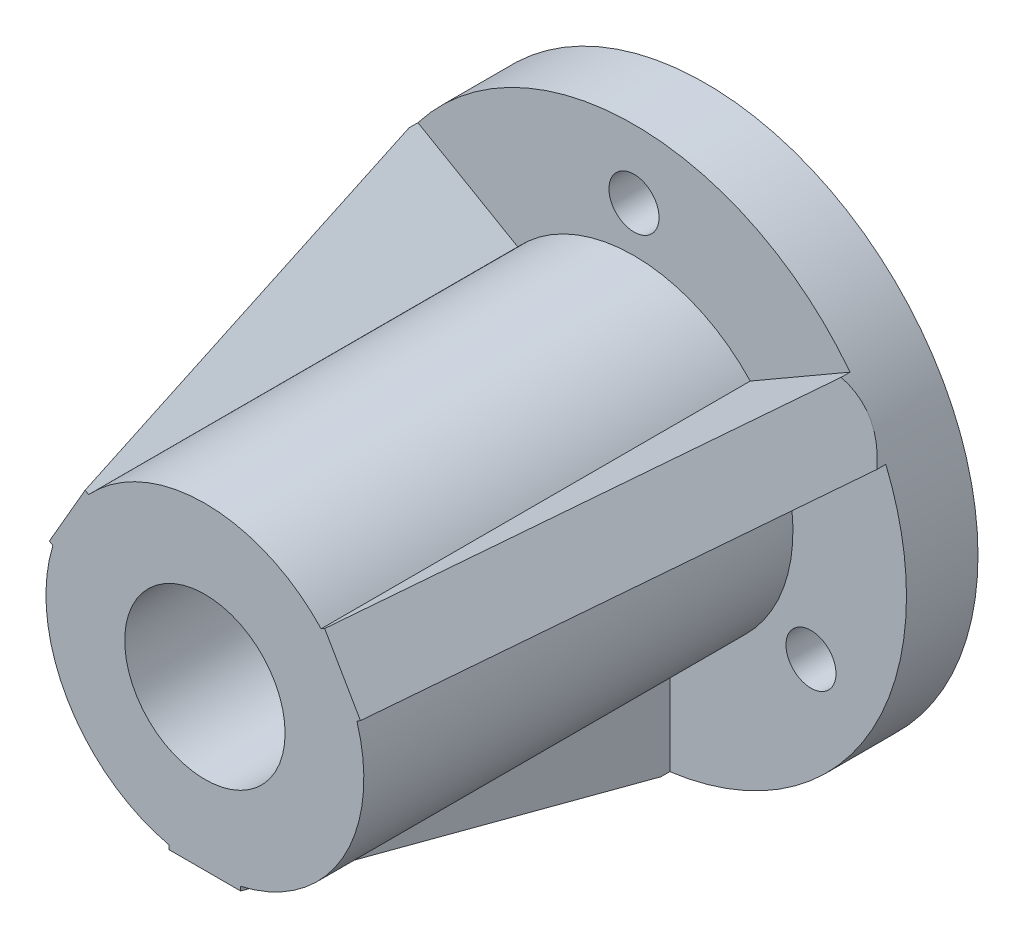
ISO-10303-21;
HEADER;
FILE_DESCRIPTION(('STEP AP214'),'2;1');
FILE_NAME('part.step','',(''),(''),'','','');
FILE_SCHEMA(('AUTOMOTIVE_DESIGN { 1 0 10303 214 1 1 1 1 }'));
ENDSEC;
DATA;
#1=APPLICATION_CONTEXT('core data for automotive mechanical design processes');
#2=APPLICATION_PROTOCOL_DEFINITION('international standard','automotive_design',2000,#1);
#3=PRODUCT_CONTEXT('',#1,'mechanical');
#4=PRODUCT('Part','Part','',(#3));
#5=PRODUCT_RELATED_PRODUCT_CATEGORY('part','',(#4));
#6=PRODUCT_DEFINITION_FORMATION('','',#4);
#7=PRODUCT_DEFINITION_CONTEXT('part definition',#1,'design');
#8=PRODUCT_DEFINITION('design','',#6,#7);
#9=PRODUCT_DEFINITION_SHAPE('','',#8);
#10=(LENGTH_UNIT() NAMED_UNIT(*) SI_UNIT(.MILLI.,.METRE.));
#11=(NAMED_UNIT(*) PLANE_ANGLE_UNIT() SI_UNIT($,.RADIAN.));
#12=(NAMED_UNIT(*) SI_UNIT($,.STERADIAN.) SOLID_ANGLE_UNIT());
#13=UNCERTAINTY_MEASURE_WITH_UNIT(LENGTH_MEASURE(1.E-05),#10,'distance_accuracy_value','');
#14=(GEOMETRIC_REPRESENTATION_CONTEXT(3) GLOBAL_UNCERTAINTY_ASSIGNED_CONTEXT((#13)) GLOBAL_UNIT_ASSIGNED_CONTEXT((#10,
#11,#12)) REPRESENTATION_CONTEXT('',''));
#15=CARTESIAN_POINT('',(0.,0.,0.));
#16=DIRECTION('',(0.,0.,1.));
#17=DIRECTION('',(1.,0.,0.));
#18=AXIS2_PLACEMENT_3D('',#15,#16,#17);
#19=CARTESIAN_POINT('',(-2.50000000000001,-13.3549510592189,18.2737010592189));
#20=DIRECTION('',(1.,0.,0.));
#21=DIRECTION('',(0.,0.,-1.));
#22=AXIS2_PLACEMENT_3D('',#19,#20,#21);
#23=PLANE('',#22);
#24=DIRECTION('',(0.,-0.255781843958849,-0.966734528348404));
#25=VECTOR('',#24,1.);
#26=CARTESIAN_POINT('',(-2.50000000000001,-11.1125,35.));
#27=LINE('',#26,#25);
#28=CARTESIAN_POINT('',(-2.50000000000001,-11.1125,35.));
#29=VERTEX_POINT('',#28);
#30=CARTESIAN_POINT('',(-2.50000000000001,-18.8852455636669,5.62269393259763));
#31=VERTEX_POINT('',#30);
#32=EDGE_CURVE('E146',#29,#31,#27,.T.);
#33=ORIENTED_EDGE('',*,*,#32,.F.);
#34=DIRECTION('',(0.,1.,0.));
#35=VECTOR('',#34,1.);
#36=CARTESIAN_POINT('',(-2.50000000000001,-13.3549510592189,35.));
#37=LINE('',#36,#35);
#38=CARTESIAN_POINT('',(-2.50000000000001,-10.8276339174355,35.));
#39=VERTEX_POINT('',#38);
#40=EDGE_CURVE('E142',#39,#29,#37,.F.);
#41=ORIENTED_EDGE('',*,*,#40,.F.);
#42=DIRECTION('',(0.,0.,1.));
#43=VECTOR('',#42,1.);
#44=CARTESIAN_POINT('',(-2.50000000000001,-10.8276339174355,4.99999999999999));
#45=LINE('',#44,#43);
#46=CARTESIAN_POINT('',(-2.50000000000001,-10.8276339174355,4.99999999999999));
#47=VERTEX_POINT('',#46);
#48=EDGE_CURVE('E139',#47,#39,#45,.T.);
#49=ORIENTED_EDGE('',*,*,#48,.F.);
#50=DIRECTION('',(0.,1.,0.));
#51=VECTOR('',#50,1.);
#52=CARTESIAN_POINT('',(-2.50000000000001,0.,4.99999999999999));
#53=LINE('',#52,#51);
#54=CARTESIAN_POINT('',(-2.50000000000001,-18.8852455636669,4.99999999999999));
#55=VERTEX_POINT('',#54);
#56=EDGE_CURVE('E127',#55,#47,#53,.T.);
#57=ORIENTED_EDGE('',*,*,#56,.F.);
#58=DIRECTION('',(0.,0.,-1.));
#59=VECTOR('',#58,1.);
#60=CARTESIAN_POINT('',(-2.50000000000001,-18.8852455636669,18.2737010592189));
#61=LINE('',#60,#59);
#62=EDGE_CURVE('E203',#31,#55,#61,.T.);
#63=ORIENTED_EDGE('',*,*,#62,.F.);
#64=EDGE_LOOP('',(#33,#41,#49,#57,#63));
#65=FACE_BOUND('',#64,.T.);
#66=ADVANCED_FACE('F16',(#65),#23,.F.);
#67=CARTESIAN_POINT('',(2.50000000000001,-13.3549510592189,18.2737010592189));
#68=DIRECTION('',(1.,0.,0.));
#69=DIRECTION('',(0.,0.,-1.));
#70=AXIS2_PLACEMENT_3D('',#67,#68,#69);
#71=PLANE('',#70);
#72=DIRECTION('',(0.,1.,0.));
#73=VECTOR('',#72,1.);
#74=CARTESIAN_POINT('',(2.50000000000001,-13.3549510592189,35.));
#75=LINE('',#74,#73);
#76=CARTESIAN_POINT('',(2.50000000000001,-10.8276339174355,35.));
#77=VERTEX_POINT('',#76);
#78=CARTESIAN_POINT('',(2.50000000000001,-11.1125,35.));
#79=VERTEX_POINT('',#78);
#80=EDGE_CURVE('E189',#77,#79,#75,.F.);
#81=ORIENTED_EDGE('',*,*,#80,.T.);
#82=DIRECTION('',(0.,-0.255781843958849,-0.966734528348404));
#83=VECTOR('',#82,1.);
#84=CARTESIAN_POINT('',(2.50000000000001,-11.1125,35.));
#85=LINE('',#84,#83);
#86=CARTESIAN_POINT('',(2.50000000000001,-18.8852455636669,5.62269393259763));
#87=VERTEX_POINT('',#86);
#88=EDGE_CURVE('E143',#87,#79,#85,.F.);
#89=ORIENTED_EDGE('',*,*,#88,.F.);
#90=DIRECTION('',(0.,0.,-1.));
#91=VECTOR('',#90,1.);
#92=CARTESIAN_POINT('',(2.50000000000001,-18.8852455636669,18.2737010592189));
#93=LINE('',#92,#91);
#94=CARTESIAN_POINT('',(2.50000000000001,-18.8852455636669,4.99999999999999));
#95=VERTEX_POINT('',#94);
#96=EDGE_CURVE('E200',#87,#95,#93,.T.);
#97=ORIENTED_EDGE('',*,*,#96,.T.);
#98=DIRECTION('',(0.,1.,0.));
#99=VECTOR('',#98,1.);
#100=CARTESIAN_POINT('',(2.50000000000001,0.,4.99999999999999));
#101=LINE('',#100,#99);
#102=CARTESIAN_POINT('',(2.50000000000001,-10.8276339174355,4.99999999999999));
#103=VERTEX_POINT('',#102);
#104=EDGE_CURVE('E157',#103,#95,#101,.F.);
#105=ORIENTED_EDGE('',*,*,#104,.F.);
#106=DIRECTION('',(0.,0.,1.));
#107=VECTOR('',#106,1.);
#108=CARTESIAN_POINT('',(2.50000000000001,-10.8276339174355,4.99999999999999));
#109=LINE('',#108,#107);
#110=EDGE_CURVE('E266',#77,#103,#109,.F.);
#111=ORIENTED_EDGE('',*,*,#110,.F.);
#112=EDGE_LOOP('',(#81,#89,#97,#105,#111));
#113=FACE_BOUND('',#112,.T.);
#114=ADVANCED_FACE('F294',(#113),#71,.T.);
#115=CARTESIAN_POINT('',(12.8157268835814,4.51241202014833,18.2737010592189));
#116=DIRECTION('',(-0.5,0.866025403784439,0.));
#117=DIRECTION('',(-0.866025403784439,-0.5,0.));
#118=AXIS2_PLACEMENT_3D('',#115,#116,#117);
#119=PLANE('',#118);
#120=DIRECTION('',(-0.22151357469519,-0.127890921979424,0.966734528348404));
#121=VECTOR('',#120,1.);
#122=CARTESIAN_POINT('',(10.8737072995546,3.3911864905389,35.));
#123=LINE('',#122,#121);
#124=CARTESIAN_POINT('',(10.8737072995546,3.3911864905389,35.));
#125=VERTEX_POINT('',#124);
#126=CARTESIAN_POINT('',(17.6051024148429,7.27755927237235,5.62269393259759));
#127=VERTEX_POINT('',#126);
#128=EDGE_CURVE('E272',#125,#127,#123,.F.);
#129=ORIENTED_EDGE('',*,*,#128,.F.);
#130=DIRECTION('',(-0.866025403784439,-0.5,0.));
#131=VECTOR('',#130,1.);
#132=CARTESIAN_POINT('',(12.8157268835814,4.51241202014833,35.));
#133=LINE('',#132,#131);
#134=CARTESIAN_POINT('',(10.6270060353772,3.24875344925666,35.));
#135=VERTEX_POINT('',#134);
#136=EDGE_CURVE('E187',#135,#125,#133,.F.);
#137=ORIENTED_EDGE('',*,*,#136,.F.);
#138=DIRECTION('',(0.,0.,1.));
#139=VECTOR('',#138,1.);
#140=CARTESIAN_POINT('',(10.6270060353772,3.24875344925666,4.99999999999999));
#141=LINE('',#140,#139);
#142=CARTESIAN_POINT('',(10.6270060353772,3.24875344925666,4.99999999999999));
#143=VERTEX_POINT('',#142);
#144=EDGE_CURVE('E274',#143,#135,#141,.T.);
#145=ORIENTED_EDGE('',*,*,#144,.F.);
#146=DIRECTION('',(-0.86602540378444,-0.499999999999998,0.));
#147=VECTOR('',#146,1.);
#148=CARTESIAN_POINT('',(17.6051024148429,7.27755927237234,4.99999999999999));
#149=LINE('',#148,#147);
#150=CARTESIAN_POINT('',(17.6051024148429,7.27755927237234,4.99999999999999));
#151=VERTEX_POINT('',#150);
#152=EDGE_CURVE('E160',#151,#143,#149,.T.);
#153=ORIENTED_EDGE('',*,*,#152,.F.);
#154=DIRECTION('',(0.,0.,1.));
#155=VECTOR('',#154,1.);
#156=CARTESIAN_POINT('',(17.6051024148429,7.27755927237235,18.2737010592189));
#157=LINE('',#156,#155);
#158=EDGE_CURVE('E185',#127,#151,#157,.F.);
#159=ORIENTED_EDGE('',*,*,#158,.F.);
#160=EDGE_LOOP('',(#129,#137,#145,#153,#159));
#161=FACE_BOUND('',#160,.T.);
#162=ADVANCED_FACE('F333',(#161),#119,.F.);
#163=CARTESIAN_POINT('',(10.3157268835814,8.84253903907052,18.2737010592189));
#164=DIRECTION('',(-0.5,0.866025403784439,0.));
#165=DIRECTION('',(-0.866025403784439,-0.5,0.));
#166=AXIS2_PLACEMENT_3D('',#163,#164,#165);
#167=PLANE('',#166);
#168=DIRECTION('',(-0.866025403784439,-0.5,0.));
#169=VECTOR('',#168,1.);
#170=CARTESIAN_POINT('',(10.3157268835814,8.84253903907052,35.));
#171=LINE('',#170,#169);
#172=CARTESIAN_POINT('',(8.12700603537719,7.57888046817885,35.));
#173=VERTEX_POINT('',#172);
#174=CARTESIAN_POINT('',(8.37370729955457,7.7213135094611,35.));
#175=VERTEX_POINT('',#174);
#176=EDGE_CURVE('E177',#173,#175,#171,.F.);
#177=ORIENTED_EDGE('',*,*,#176,.T.);
#178=DIRECTION('',(-0.22151357469519,-0.127890921979424,0.966734528348404));
#179=VECTOR('',#178,1.);
#180=CARTESIAN_POINT('',(8.37370729955457,7.7213135094611,35.));
#181=LINE('',#180,#179);
#182=CARTESIAN_POINT('',(15.1051024148429,11.6076862912945,5.62269393259759));
#183=VERTEX_POINT('',#182);
#184=EDGE_CURVE('E265',#183,#175,#181,.T.);
#185=ORIENTED_EDGE('',*,*,#184,.F.);
#186=DIRECTION('',(0.,0.,1.));
#187=VECTOR('',#186,1.);
#188=CARTESIAN_POINT('',(15.1051024148429,11.6076862912945,18.2737010592189));
#189=LINE('',#188,#187);
#190=CARTESIAN_POINT('',(15.1051024148429,11.6076862912945,4.99999999999999));
#191=VERTEX_POINT('',#190);
#192=EDGE_CURVE('E182',#183,#191,#189,.F.);
#193=ORIENTED_EDGE('',*,*,#192,.T.);
#194=DIRECTION('',(0.866025403784438,0.500000000000001,0.));
#195=VECTOR('',#194,1.);
#196=CARTESIAN_POINT('',(8.12700603537719,7.57888046817885,4.99999999999999));
#197=LINE('',#196,#195);
#198=CARTESIAN_POINT('',(8.12700603537718,7.57888046817885,4.99999999999999));
#199=VERTEX_POINT('',#198);
#200=EDGE_CURVE('E152',#199,#191,#197,.T.);
#201=ORIENTED_EDGE('',*,*,#200,.F.);
#202=DIRECTION('',(0.,0.,1.));
#203=VECTOR('',#202,1.);
#204=CARTESIAN_POINT('',(8.12700603537719,7.57888046817885,4.99999999999999));
#205=LINE('',#204,#203);
#206=EDGE_CURVE('E262',#173,#199,#205,.F.);
#207=ORIENTED_EDGE('',*,*,#206,.F.);
#208=EDGE_LOOP('',(#177,#185,#193,#201,#207));
#209=FACE_BOUND('',#208,.T.);
#210=ADVANCED_FACE('F331',(#209),#167,.T.);
#211=CARTESIAN_POINT('',(-12.8157268835814,4.51241202014833,18.2737010592189));
#212=DIRECTION('',(-0.500000000000001,-0.866025403784438,0.));
#213=DIRECTION('',(0.866025403784438,-0.500000000000001,0.));
#214=AXIS2_PLACEMENT_3D('',#211,#212,#213);
#215=PLANE('',#214);
#216=DIRECTION('',(0.866025403784438,-0.500000000000001,0.));
#217=VECTOR('',#216,1.);
#218=CARTESIAN_POINT('',(-12.8157268835814,4.51241202014833,35.));
#219=LINE('',#218,#217);
#220=CARTESIAN_POINT('',(-10.6270060353772,3.24875344925666,35.));
#221=VERTEX_POINT('',#220);
#222=CARTESIAN_POINT('',(-10.8737072995546,3.39118649053891,35.));
#223=VERTEX_POINT('',#222);
#224=EDGE_CURVE('E34',#221,#223,#219,.F.);
#225=ORIENTED_EDGE('',*,*,#224,.T.);
#226=DIRECTION('',(0.22151357469519,-0.127890921979425,0.966734528348404));
#227=VECTOR('',#226,1.);
#228=CARTESIAN_POINT('',(-10.8737072995546,3.39118649053891,35.));
#229=LINE('',#228,#227);
#230=CARTESIAN_POINT('',(-17.6051024148429,7.27755927237236,5.62269393259765));
#231=VERTEX_POINT('',#230);
#232=EDGE_CURVE('E261',#231,#223,#229,.T.);
#233=ORIENTED_EDGE('',*,*,#232,.F.);
#234=DIRECTION('',(0.,0.,1.));
#235=VECTOR('',#234,1.);
#236=CARTESIAN_POINT('',(-17.6051024148429,7.27755927237235,18.2737010592189));
#237=LINE('',#236,#235);
#238=CARTESIAN_POINT('',(-17.6051024148429,7.27755927237236,4.99999999999999));
#239=VERTEX_POINT('',#238);
#240=EDGE_CURVE('E175',#231,#239,#237,.F.);
#241=ORIENTED_EDGE('',*,*,#240,.T.);
#242=DIRECTION('',(-0.866025403784438,0.500000000000001,0.));
#243=VECTOR('',#242,1.);
#244=CARTESIAN_POINT('',(-10.6270060353772,3.24875344925666,4.99999999999999));
#245=LINE('',#244,#243);
#246=CARTESIAN_POINT('',(-10.6270060353772,3.24875344925666,4.99999999999999));
#247=VERTEX_POINT('',#246);
#248=EDGE_CURVE('E135',#247,#239,#245,.T.);
#249=ORIENTED_EDGE('',*,*,#248,.F.);
#250=DIRECTION('',(0.,0.,1.));
#251=VECTOR('',#250,1.);
#252=CARTESIAN_POINT('',(-10.6270060353772,3.24875344925666,4.99999999999999));
#253=LINE('',#252,#251);
#254=EDGE_CURVE('E120',#221,#247,#253,.F.);
#255=ORIENTED_EDGE('',*,*,#254,.F.);
#256=EDGE_LOOP('',(#225,#233,#241,#249,#255));
#257=FACE_BOUND('',#256,.T.);
#258=ADVANCED_FACE('F298',(#257),#215,.T.);
#259=CARTESIAN_POINT('',(-10.3157268835814,8.84253903907055,18.2737010592189));
#260=DIRECTION('',(-0.500000000000001,-0.866025403784438,0.));
#261=DIRECTION('',(0.866025403784438,-0.500000000000001,0.));
#262=AXIS2_PLACEMENT_3D('',#259,#260,#261);
#263=PLANE('',#262);
#264=DIRECTION('',(0.22151357469519,-0.127890921979425,0.966734528348404));
#265=VECTOR('',#264,1.);
#266=CARTESIAN_POINT('',(-8.37370729955457,7.72131350946109,35.));
#267=LINE('',#266,#265);
#268=CARTESIAN_POINT('',(-8.37370729955457,7.7213135094611,35.));
#269=VERTEX_POINT('',#268);
#270=CARTESIAN_POINT('',(-15.1051024148429,11.6076862912946,5.62269393259761));
#271=VERTEX_POINT('',#270);
#272=EDGE_CURVE('E258',#269,#271,#267,.F.);
#273=ORIENTED_EDGE('',*,*,#272,.F.);
#274=DIRECTION('',(0.866025403784438,-0.500000000000001,0.));
#275=VECTOR('',#274,1.);
#276=CARTESIAN_POINT('',(-10.3157268835814,8.84253903907055,35.));
#277=LINE('',#276,#275);
#278=CARTESIAN_POINT('',(-8.12700603537717,7.57888046817887,35.));
#279=VERTEX_POINT('',#278);
#280=EDGE_CURVE('E164',#279,#269,#277,.F.);
#281=ORIENTED_EDGE('',*,*,#280,.F.);
#282=DIRECTION('',(0.,0.,1.));
#283=VECTOR('',#282,1.);
#284=CARTESIAN_POINT('',(-8.12700603537717,7.57888046817886,4.99999999999999));
#285=LINE('',#284,#283);
#286=CARTESIAN_POINT('',(-8.12700603537717,7.57888046817886,4.99999999999999));
#287=VERTEX_POINT('',#286);
#288=EDGE_CURVE('E312',#287,#279,#285,.T.);
#289=ORIENTED_EDGE('',*,*,#288,.F.);
#290=DIRECTION('',(0.866025403784439,-0.5,0.));
#291=VECTOR('',#290,1.);
#292=CARTESIAN_POINT('',(-15.1051024148429,11.6076862912946,4.99999999999999));
#293=LINE('',#292,#291);
#294=CARTESIAN_POINT('',(-15.1051024148429,11.6076862912946,4.99999999999999));
#295=VERTEX_POINT('',#294);
#296=EDGE_CURVE('E134',#295,#287,#293,.T.);
#297=ORIENTED_EDGE('',*,*,#296,.F.);
#298=DIRECTION('',(0.,0.,1.));
#299=VECTOR('',#298,1.);
#300=CARTESIAN_POINT('',(-15.1051024148429,11.6076862912946,18.2737010592189));
#301=LINE('',#300,#299);
#302=EDGE_CURVE('E162',#271,#295,#301,.F.);
#303=ORIENTED_EDGE('',*,*,#302,.F.);
#304=EDGE_LOOP('',(#273,#281,#289,#297,#303));
#305=FACE_BOUND('',#304,.T.);
#306=ADVANCED_FACE('F388',(#305),#263,.F.);
#307=CARTESIAN_POINT('',(0.,0.,4.99999999999999));
#308=DIRECTION('',(0.,0.,1.));
#309=DIRECTION('',(1.,0.,0.));
#310=AXIS2_PLACEMENT_3D('',#307,#308,#309);
#311=PLANE('',#310);
#312=CARTESIAN_POINT('',(12.3733379565702,-7.14375,4.99999999999999));
#313=DIRECTION('',(0.,0.,-1.));
#314=DIRECTION('',(-1.,0.,0.));
#315=AXIS2_PLACEMENT_3D('',#312,#313,#314);
#316=CIRCLE('',#315,1.75000000000001);
#317=CARTESIAN_POINT('',(10.6233379565702,-7.14375,4.99999999999999));
#318=VERTEX_POINT('',#317);
#319=EDGE_CURVE('E239',#318,#318,#316,.T.);
#320=ORIENTED_EDGE('',*,*,#319,.T.);
#321=EDGE_LOOP('',(#320));
#322=FACE_BOUND('',#321,.T.);
#323=ORIENTED_EDGE('',*,*,#104,.T.);
#324=CARTESIAN_POINT('',(0.,0.,4.99999999999999));
#325=DIRECTION('',(0.,0.,1.));
#326=DIRECTION('',(1.,0.,0.));
#327=AXIS2_PLACEMENT_3D('',#324,#325,#326);
#328=CIRCLE('',#327,19.05);
#329=EDGE_CURVE('E255',#151,#95,#328,.F.);
#330=ORIENTED_EDGE('',*,*,#329,.F.);
#331=ORIENTED_EDGE('',*,*,#152,.T.);
#332=CARTESIAN_POINT('',(0.,0.,4.99999999999999));
#333=DIRECTION('',(0.,0.,1.));
#334=DIRECTION('',(1.,0.,0.));
#335=AXIS2_PLACEMENT_3D('',#332,#333,#334);
#336=CIRCLE('',#335,11.1125);
#337=EDGE_CURVE('E263',#103,#143,#336,.T.);
#338=ORIENTED_EDGE('',*,*,#337,.F.);
#339=EDGE_LOOP('',(#323,#330,#331,#338));
#340=FACE_BOUND('',#339,.T.);
#341=ADVANCED_FACE('F390',(#322,#340),#311,.T.);
#342=CARTESIAN_POINT('',(0.,0.,4.99999999999999));
#343=DIRECTION('',(0.,0.,1.));
#344=DIRECTION('',(1.,0.,0.));
#345=AXIS2_PLACEMENT_3D('',#342,#343,#344);
#346=PLANE('',#345);
#347=CARTESIAN_POINT('',(-12.3733379565702,-7.14375,4.99999999999999));
#348=DIRECTION('',(0.,0.,-1.));
#349=DIRECTION('',(-1.,0.,0.));
#350=AXIS2_PLACEMENT_3D('',#347,#348,#349);
#351=CIRCLE('',#350,1.75000000000001);
#352=CARTESIAN_POINT('',(-14.1233379565702,-7.14375,4.99999999999999));
#353=VERTEX_POINT('',#352);
#354=EDGE_CURVE('E236',#353,#353,#351,.T.);
#355=ORIENTED_EDGE('',*,*,#354,.T.);
#356=EDGE_LOOP('',(#355));
#357=FACE_BOUND('',#356,.T.);
#358=ORIENTED_EDGE('',*,*,#56,.T.);
#359=CARTESIAN_POINT('',(0.,0.,4.99999999999999));
#360=DIRECTION('',(0.,0.,1.));
#361=DIRECTION('',(1.,0.,0.));
#362=AXIS2_PLACEMENT_3D('',#359,#360,#361);
#363=CIRCLE('',#362,11.1125);
#364=EDGE_CURVE('E19',#247,#47,#363,.T.);
#365=ORIENTED_EDGE('',*,*,#364,.F.);
#366=ORIENTED_EDGE('',*,*,#248,.T.);
#367=CARTESIAN_POINT('',(0.,0.,4.99999999999999));
#368=DIRECTION('',(0.,0.,1.));
#369=DIRECTION('',(1.,0.,0.));
#370=AXIS2_PLACEMENT_3D('',#367,#368,#369);
#371=CIRCLE('',#370,19.05);
#372=EDGE_CURVE('E131',#55,#239,#371,.F.);
#373=ORIENTED_EDGE('',*,*,#372,.F.);
#374=EDGE_LOOP('',(#358,#365,#366,#373));
#375=FACE_BOUND('',#374,.T.);
#376=ADVANCED_FACE('F128',(#357,#375),#346,.T.);
#377=CARTESIAN_POINT('',(0.,0.,4.99999999999999));
#378=DIRECTION('',(0.,0.,1.));
#379=DIRECTION('',(1.,0.,0.));
#380=AXIS2_PLACEMENT_3D('',#377,#378,#379);
#381=PLANE('',#380);
#382=CARTESIAN_POINT('',(0.,14.2875,4.99999999999999));
#383=DIRECTION('',(0.,0.,-1.));
#384=DIRECTION('',(-1.,0.,0.));
#385=AXIS2_PLACEMENT_3D('',#382,#383,#384);
#386=CIRCLE('',#385,1.75000000000001);
#387=CARTESIAN_POINT('',(-1.75000000000001,14.2875,4.99999999999999));
#388=VERTEX_POINT('',#387);
#389=EDGE_CURVE('E233',#388,#388,#386,.T.);
#390=ORIENTED_EDGE('',*,*,#389,.T.);
#391=EDGE_LOOP('',(#390));
#392=FACE_BOUND('',#391,.T.);
#393=ORIENTED_EDGE('',*,*,#200,.T.);
#394=CARTESIAN_POINT('',(0.,0.,4.99999999999999));
#395=DIRECTION('',(0.,0.,1.));
#396=DIRECTION('',(1.,0.,0.));
#397=AXIS2_PLACEMENT_3D('',#394,#395,#396);
#398=CIRCLE('',#397,19.05);
#399=EDGE_CURVE('E245',#295,#191,#398,.F.);
#400=ORIENTED_EDGE('',*,*,#399,.F.);
#401=ORIENTED_EDGE('',*,*,#296,.T.);
#402=CARTESIAN_POINT('',(0.,0.,4.99999999999999));
#403=DIRECTION('',(0.,0.,1.));
#404=DIRECTION('',(1.,0.,0.));
#405=AXIS2_PLACEMENT_3D('',#402,#403,#404);
#406=CIRCLE('',#405,11.1125);
#407=EDGE_CURVE('E259',#199,#287,#406,.T.);
#408=ORIENTED_EDGE('',*,*,#407,.F.);
#409=EDGE_LOOP('',(#393,#400,#401,#408));
#410=FACE_BOUND('',#409,.T.);
#411=ADVANCED_FACE('F386',(#392,#410),#381,.T.);
#412=CARTESIAN_POINT('',(0.,0.,4.99999999999999));
#413=DIRECTION('',(0.,0.,1.));
#414=DIRECTION('',(1.,0.,0.));
#415=AXIS2_PLACEMENT_3D('',#412,#413,#414);
#416=CYLINDRICAL_SURFACE('',#415,11.1125);
#417=ORIENTED_EDGE('',*,*,#48,.T.);
#418=CARTESIAN_POINT('',(0.,0.,35.));
#419=DIRECTION('',(0.,0.,1.));
#420=DIRECTION('',(1.,0.,0.));
#421=AXIS2_PLACEMENT_3D('',#418,#419,#420);
#422=CIRCLE('',#421,11.1125);
#423=EDGE_CURVE('E211',#221,#39,#422,.T.);
#424=ORIENTED_EDGE('',*,*,#423,.F.);
#425=ORIENTED_EDGE('',*,*,#254,.T.);
#426=ORIENTED_EDGE('',*,*,#364,.T.);
#427=EDGE_LOOP('',(#417,#424,#425,#426));
#428=FACE_BOUND('',#427,.T.);
#429=ADVANCED_FACE('F138',(#428),#416,.T.);
#430=CARTESIAN_POINT('',(0.,-11.1125,35.));
#431=DIRECTION('',(0.,-0.966734528348404,0.255781843958849));
#432=DIRECTION('',(0.,-0.255781843958849,-0.966734528348404));
#433=AXIS2_PLACEMENT_3D('',#430,#431,#432);
#434=PLANE('',#433);
#435=DIRECTION('',(1.,0.,0.));
#436=VECTOR('',#435,1.);
#437=CARTESIAN_POINT('',(0.,-11.1125,35.));
#438=LINE('',#437,#436);
#439=EDGE_CURVE('E208',#29,#79,#438,.T.);
#440=ORIENTED_EDGE('',*,*,#439,.F.);
#441=ORIENTED_EDGE('',*,*,#32,.T.);
#442=CARTESIAN_POINT('',(0.,0.,76.9999999999999));
#443=DIRECTION('',(0.,-0.966734528348404,0.255781843958849));
#444=DIRECTION('',(0.,0.255781843958849,0.966734528348404));
#445=AXIS2_PLACEMENT_3D('',#442,#443,#444);
#446=ELLIPSE('',#445,74.477530168501,19.05);
#447=EDGE_CURVE('E252',#87,#31,#446,.F.);
#448=ORIENTED_EDGE('',*,*,#447,.F.);
#449=ORIENTED_EDGE('',*,*,#88,.T.);
#450=EDGE_LOOP('',(#440,#441,#448,#449));
#451=FACE_BOUND('',#450,.T.);
#452=ADVANCED_FACE('F288',(#451),#434,.T.);
#453=CARTESIAN_POINT('',(0.,0.,4.99999999999999));
#454=DIRECTION('',(0.,0.,1.));
#455=DIRECTION('',(1.,0.,0.));
#456=AXIS2_PLACEMENT_3D('',#453,#454,#455);
#457=CYLINDRICAL_SURFACE('',#456,11.1125);
#458=ORIENTED_EDGE('',*,*,#110,.T.);
#459=ORIENTED_EDGE('',*,*,#337,.T.);
#460=ORIENTED_EDGE('',*,*,#144,.T.);
#461=CARTESIAN_POINT('',(0.,0.,35.));
#462=DIRECTION('',(0.,0.,1.));
#463=DIRECTION('',(1.,0.,0.));
#464=AXIS2_PLACEMENT_3D('',#461,#462,#463);
#465=CIRCLE('',#464,11.1125);
#466=EDGE_CURVE('E195',#77,#135,#465,.T.);
#467=ORIENTED_EDGE('',*,*,#466,.F.);
#468=EDGE_LOOP('',(#458,#459,#460,#467));
#469=FACE_BOUND('',#468,.T.);
#470=ADVANCED_FACE('F334',(#469),#457,.T.);
#471=CARTESIAN_POINT('',(9.62370729955458,5.55625,35.));
#472=DIRECTION('',(0.837216660265286,0.483367264174202,0.255781843958849));
#473=DIRECTION('',(-0.5,0.866025403784439,0.));
#474=AXIS2_PLACEMENT_3D('',#471,#472,#473);
#475=PLANE('',#474);
#476=DIRECTION('',(-0.500000000000001,0.866025403784438,0.));
#477=VECTOR('',#476,1.);
#478=CARTESIAN_POINT('',(10.8737072995546,3.39118649053891,35.));
#479=LINE('',#478,#477);
#480=EDGE_CURVE('E192',#125,#175,#479,.T.);
#481=ORIENTED_EDGE('',*,*,#480,.F.);
#482=ORIENTED_EDGE('',*,*,#128,.T.);
#483=CARTESIAN_POINT('',(0.,0.,77.));
#484=DIRECTION('',(0.837216660265286,0.483367264174202,0.255781843958849));
#485=DIRECTION('',(-0.22151357469519,-0.127890921979424,0.966734528348404));
#486=AXIS2_PLACEMENT_3D('',#483,#484,#485);
#487=ELLIPSE('',#486,74.4775301685011,19.05);
#488=EDGE_CURVE('E242',#183,#127,#487,.F.);
#489=ORIENTED_EDGE('',*,*,#488,.F.);
#490=ORIENTED_EDGE('',*,*,#184,.T.);
#491=EDGE_LOOP('',(#481,#482,#489,#490));
#492=FACE_BOUND('',#491,.T.);
#493=ADVANCED_FACE('F324',(#492),#475,.T.);
#494=CARTESIAN_POINT('',(0.,0.,4.99999999999999));
#495=DIRECTION('',(0.,0.,1.));
#496=DIRECTION('',(1.,0.,0.));
#497=AXIS2_PLACEMENT_3D('',#494,#495,#496);
#498=CYLINDRICAL_SURFACE('',#497,11.1125);
#499=ORIENTED_EDGE('',*,*,#206,.T.);
#500=ORIENTED_EDGE('',*,*,#407,.T.);
#501=ORIENTED_EDGE('',*,*,#288,.T.);
#502=CARTESIAN_POINT('',(0.,0.,35.));
#503=DIRECTION('',(0.,0.,1.));
#504=DIRECTION('',(1.,0.,0.));
#505=AXIS2_PLACEMENT_3D('',#502,#503,#504);
#506=CIRCLE('',#505,11.1125);
#507=EDGE_CURVE('E172',#173,#279,#506,.T.);
#508=ORIENTED_EDGE('',*,*,#507,.F.);
#509=EDGE_LOOP('',(#499,#500,#501,#508));
#510=FACE_BOUND('',#509,.T.);
#511=ADVANCED_FACE('F342',(#510),#498,.T.);
#512=CARTESIAN_POINT('',(-9.62370729955458,5.55625,35.));
#513=DIRECTION('',(-0.837216660265285,0.483367264174203,0.255781843958849));
#514=DIRECTION('',(-0.500000000000001,-0.866025403784438,0.));
#515=AXIS2_PLACEMENT_3D('',#512,#513,#514);
#516=PLANE('',#515);
#517=DIRECTION('',(-0.500000000000001,-0.866025403784438,0.));
#518=VECTOR('',#517,1.);
#519=CARTESIAN_POINT('',(-8.37370729955457,7.7213135094611,35.));
#520=LINE('',#519,#518);
#521=EDGE_CURVE('E168',#269,#223,#520,.T.);
#522=ORIENTED_EDGE('',*,*,#521,.F.);
#523=ORIENTED_EDGE('',*,*,#272,.T.);
#524=CARTESIAN_POINT('',(0.,0.,77.));
#525=DIRECTION('',(-0.837216660265285,0.483367264174203,0.255781843958849));
#526=DIRECTION('',(0.22151357469519,-0.127890921979425,0.966734528348404));
#527=AXIS2_PLACEMENT_3D('',#524,#525,#526);
#528=ELLIPSE('',#527,74.477530168501,19.05);
#529=EDGE_CURVE('E248',#231,#271,#528,.F.);
#530=ORIENTED_EDGE('',*,*,#529,.F.);
#531=ORIENTED_EDGE('',*,*,#232,.T.);
#532=EDGE_LOOP('',(#522,#523,#530,#531));
#533=FACE_BOUND('',#532,.T.);
#534=ADVANCED_FACE('F303',(#533),#516,.T.);
#535=CARTESIAN_POINT('',(0.,0.,0.));
#536=DIRECTION('',(0.,0.,1.));
#537=DIRECTION('',(1.,0.,0.));
#538=AXIS2_PLACEMENT_3D('',#535,#536,#537);
#539=CYLINDRICAL_SURFACE('',#538,19.05);
#540=CARTESIAN_POINT('',(0.,0.,0.));
#541=DIRECTION('',(0.,0.,1.));
#542=DIRECTION('',(1.,0.,0.));
#543=AXIS2_PLACEMENT_3D('',#540,#541,#542);
#544=CIRCLE('',#543,19.05);
#545=CARTESIAN_POINT('',(19.05,0.,0.));
#546=VERTEX_POINT('',#545);
#547=EDGE_CURVE('E171',#546,#546,#544,.T.);
#548=ORIENTED_EDGE('',*,*,#547,.T.);
#549=EDGE_LOOP('',(#548));
#550=FACE_BOUND('',#549,.T.);
#551=ORIENTED_EDGE('',*,*,#488,.T.);
#552=ORIENTED_EDGE('',*,*,#158,.T.);
#553=ORIENTED_EDGE('',*,*,#329,.T.);
#554=ORIENTED_EDGE('',*,*,#96,.F.);
#555=ORIENTED_EDGE('',*,*,#447,.T.);
#556=ORIENTED_EDGE('',*,*,#62,.T.);
#557=ORIENTED_EDGE('',*,*,#372,.T.);
#558=ORIENTED_EDGE('',*,*,#240,.F.);
#559=ORIENTED_EDGE('',*,*,#529,.T.);
#560=ORIENTED_EDGE('',*,*,#302,.T.);
#561=ORIENTED_EDGE('',*,*,#399,.T.);
#562=ORIENTED_EDGE('',*,*,#192,.F.);
#563=EDGE_LOOP('',(#551,#552,#553,#554,#555,#556,#557,#558,#559,#560,#561,#562));
#564=FACE_BOUND('',#563,.T.);
#565=ADVANCED_FACE('F290',(#550,#564),#539,.T.);
#566=CARTESIAN_POINT('',(12.3733379565702,-7.14375,4.99999999999999));
#567=DIRECTION('',(0.,0.,-1.));
#568=DIRECTION('',(-1.,0.,0.));
#569=AXIS2_PLACEMENT_3D('',#566,#567,#568);
#570=CYLINDRICAL_SURFACE('',#569,1.75000000000001);
#571=ORIENTED_EDGE('',*,*,#319,.F.);
#572=EDGE_LOOP('',(#571));
#573=FACE_BOUND('',#572,.T.);
#574=CARTESIAN_POINT('',(12.3733379565702,-7.14375,0.));
#575=DIRECTION('',(0.,0.,-1.));
#576=DIRECTION('',(-1.,0.,0.));
#577=AXIS2_PLACEMENT_3D('',#574,#575,#576);
#578=CIRCLE('',#577,1.75000000000001);
#579=CARTESIAN_POINT('',(10.6233379565702,-7.14375,0.));
#580=VERTEX_POINT('',#579);
#581=EDGE_CURVE('E223',#580,#580,#578,.T.);
#582=ORIENTED_EDGE('',*,*,#581,.T.);
#583=EDGE_LOOP('',(#582));
#584=FACE_BOUND('',#583,.T.);
#585=ADVANCED_FACE('F368',(#573,#584),#570,.F.);
#586=CARTESIAN_POINT('',(-12.3733379565702,-7.14375,4.99999999999999));
#587=DIRECTION('',(0.,0.,-1.));
#588=DIRECTION('',(-1.,0.,0.));
#589=AXIS2_PLACEMENT_3D('',#586,#587,#588);
#590=CYLINDRICAL_SURFACE('',#589,1.75000000000001);
#591=ORIENTED_EDGE('',*,*,#354,.F.);
#592=EDGE_LOOP('',(#591));
#593=FACE_BOUND('',#592,.T.);
#594=CARTESIAN_POINT('',(-12.3733379565702,-7.14375,0.));
#595=DIRECTION('',(0.,0.,-1.));
#596=DIRECTION('',(-1.,0.,0.));
#597=AXIS2_PLACEMENT_3D('',#594,#595,#596);
#598=CIRCLE('',#597,1.75000000000001);
#599=CARTESIAN_POINT('',(-14.1233379565702,-7.14375,0.));
#600=VERTEX_POINT('',#599);
#601=EDGE_CURVE('E220',#600,#600,#598,.T.);
#602=ORIENTED_EDGE('',*,*,#601,.T.);
#603=EDGE_LOOP('',(#602));
#604=FACE_BOUND('',#603,.T.);
#605=ADVANCED_FACE('F364',(#593,#604),#590,.F.);
#606=CARTESIAN_POINT('',(0.,14.2875,4.99999999999999));
#607=DIRECTION('',(0.,0.,-1.));
#608=DIRECTION('',(-1.,0.,0.));
#609=AXIS2_PLACEMENT_3D('',#606,#607,#608);
#610=CYLINDRICAL_SURFACE('',#609,1.75000000000001);
#611=ORIENTED_EDGE('',*,*,#389,.F.);
#612=EDGE_LOOP('',(#611));
#613=FACE_BOUND('',#612,.T.);
#614=CARTESIAN_POINT('',(0.,14.2875,0.));
#615=DIRECTION('',(0.,0.,-1.));
#616=DIRECTION('',(-1.,0.,0.));
#617=AXIS2_PLACEMENT_3D('',#614,#615,#616);
#618=CIRCLE('',#617,1.75000000000001);
#619=CARTESIAN_POINT('',(-1.75000000000001,14.2875,0.));
#620=VERTEX_POINT('',#619);
#621=EDGE_CURVE('E217',#620,#620,#618,.T.);
#622=ORIENTED_EDGE('',*,*,#621,.T.);
#623=EDGE_LOOP('',(#622));
#624=FACE_BOUND('',#623,.T.);
#625=ADVANCED_FACE('F360',(#613,#624),#610,.F.);
#626=CARTESIAN_POINT('',(0.,0.,35.));
#627=DIRECTION('',(0.,0.,1.));
#628=DIRECTION('',(1.,0.,0.));
#629=AXIS2_PLACEMENT_3D('',#626,#627,#628);
#630=PLANE('',#629);
#631=CARTESIAN_POINT('',(0.,0.,35.));
#632=DIRECTION('',(0.,0.,1.));
#633=DIRECTION('',(1.,0.,0.));
#634=AXIS2_PLACEMENT_3D('',#631,#632,#633);
#635=CIRCLE('',#634,5.60625);
#636=CARTESIAN_POINT('',(5.60625,0.,35.));
#637=VERTEX_POINT('',#636);
#638=EDGE_CURVE('E25',#637,#637,#635,.F.);
#639=ORIENTED_EDGE('',*,*,#638,.T.);
#640=EDGE_LOOP('',(#639));
#641=FACE_BOUND('',#640,.T.);
#642=ORIENTED_EDGE('',*,*,#521,.T.);
#643=ORIENTED_EDGE('',*,*,#224,.F.);
#644=ORIENTED_EDGE('',*,*,#423,.T.);
#645=ORIENTED_EDGE('',*,*,#40,.T.);
#646=ORIENTED_EDGE('',*,*,#439,.T.);
#647=ORIENTED_EDGE('',*,*,#80,.F.);
#648=ORIENTED_EDGE('',*,*,#466,.T.);
#649=ORIENTED_EDGE('',*,*,#136,.T.);
#650=ORIENTED_EDGE('',*,*,#480,.T.);
#651=ORIENTED_EDGE('',*,*,#176,.F.);
#652=ORIENTED_EDGE('',*,*,#507,.T.);
#653=ORIENTED_EDGE('',*,*,#280,.T.);
#654=EDGE_LOOP('',(#642,#643,#644,#645,#646,#647,#648,#649,#650,#651,#652,#653));
#655=FACE_BOUND('',#654,.T.);
#656=ADVANCED_FACE('F296',(#641,#655),#630,.T.);
#657=CARTESIAN_POINT('',(0.,0.,0.));
#658=DIRECTION('',(0.,0.,1.));
#659=DIRECTION('',(1.,0.,0.));
#660=AXIS2_PLACEMENT_3D('',#657,#658,#659);
#661=PLANE('',#660);
#662=CARTESIAN_POINT('',(0.,0.,0.));
#663=DIRECTION('',(0.,0.,1.));
#664=DIRECTION('',(1.,0.,0.));
#665=AXIS2_PLACEMENT_3D('',#662,#663,#664);
#666=CIRCLE('',#665,5.60625);
#667=CARTESIAN_POINT('',(5.60625,0.,0.));
#668=VERTEX_POINT('',#667);
#669=EDGE_CURVE('E11',#668,#668,#666,.T.);
#670=ORIENTED_EDGE('',*,*,#669,.T.);
#671=EDGE_LOOP('',(#670));
#672=FACE_BOUND('',#671,.T.);
#673=ORIENTED_EDGE('',*,*,#621,.F.);
#674=EDGE_LOOP('',(#673));
#675=FACE_BOUND('',#674,.T.);
#676=ORIENTED_EDGE('',*,*,#601,.F.);
#677=EDGE_LOOP('',(#676));
#678=FACE_BOUND('',#677,.T.);
#679=ORIENTED_EDGE('',*,*,#581,.F.);
#680=EDGE_LOOP('',(#679));
#681=FACE_BOUND('',#680,.T.);
#682=ORIENTED_EDGE('',*,*,#547,.F.);
#683=EDGE_LOOP('',(#682));
#684=FACE_BOUND('',#683,.T.);
#685=ADVANCED_FACE('F347',(#672,#675,#678,#681,#684),#661,.F.);
#686=CARTESIAN_POINT('',(0.,0.,0.));
#687=DIRECTION('',(0.,0.,1.));
#688=DIRECTION('',(1.,0.,0.));
#689=AXIS2_PLACEMENT_3D('',#686,#687,#688);
#690=CYLINDRICAL_SURFACE('',#689,5.60625);
#691=ORIENTED_EDGE('',*,*,#669,.F.);
#692=EDGE_LOOP('',(#691));
#693=FACE_BOUND('',#692,.T.);
#694=ORIENTED_EDGE('',*,*,#638,.F.);
#695=EDGE_LOOP('',(#694));
#696=FACE_BOUND('',#695,.T.);
#697=ADVANCED_FACE('F345',(#693,#696),#690,.F.);
#698=CLOSED_SHELL('',(#66,#114,#162,#210,#258,#306,#341,#376,#411,#429,#452,#470,#493,#511,#534,
#565,#585,#605,#625,#656,#685,#697));
#699=MANIFOLD_SOLID_BREP('B1',#698);
#700=ADVANCED_BREP_SHAPE_REPRESENTATION('',(#18,#699),#14);
#701=SHAPE_DEFINITION_REPRESENTATION(#9,#700);
ENDSEC;
END-ISO-10303-21;
